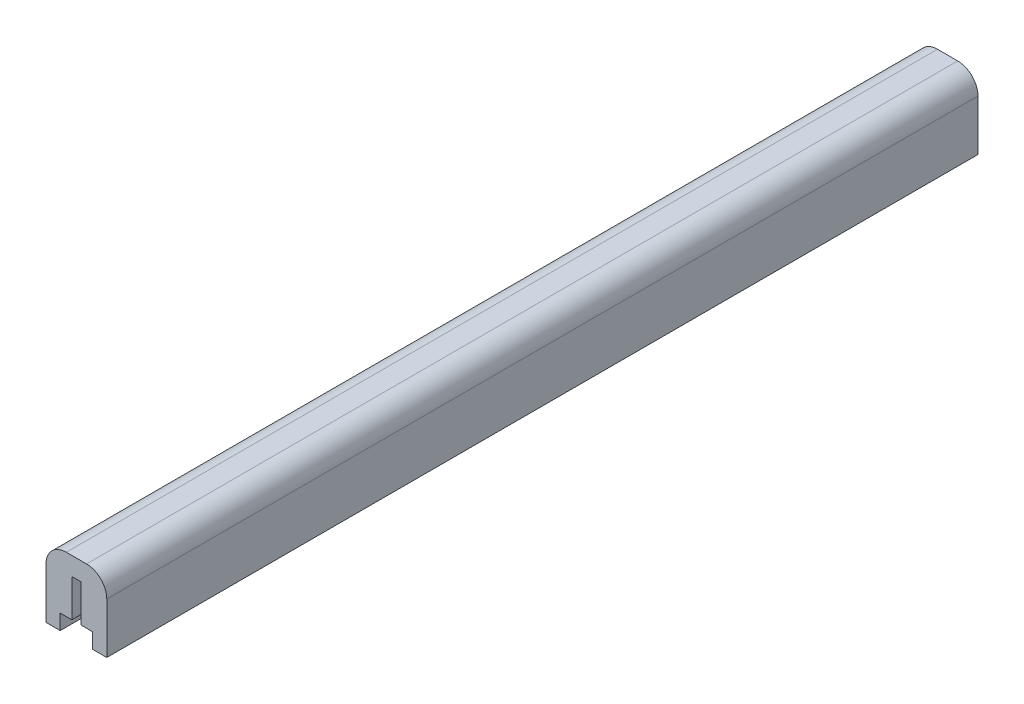
ISO-10303-21;
HEADER;
FILE_DESCRIPTION(('STEP AP214'),'2;1');
FILE_NAME('part.step','',(''),(''),'','','');
FILE_SCHEMA(('AUTOMOTIVE_DESIGN { 1 0 10303 214 1 1 1 1 }'));
ENDSEC;
DATA;
#1=APPLICATION_CONTEXT('core data for automotive mechanical design processes');
#2=APPLICATION_PROTOCOL_DEFINITION('international standard','automotive_design',2000,#1);
#3=PRODUCT_CONTEXT('',#1,'mechanical');
#4=PRODUCT('Part','Part','',(#3));
#5=PRODUCT_RELATED_PRODUCT_CATEGORY('part','',(#4));
#6=PRODUCT_DEFINITION_FORMATION('','',#4);
#7=PRODUCT_DEFINITION_CONTEXT('part definition',#1,'design');
#8=PRODUCT_DEFINITION('design','',#6,#7);
#9=PRODUCT_DEFINITION_SHAPE('','',#8);
#10=(LENGTH_UNIT() NAMED_UNIT(*) SI_UNIT(.MILLI.,.METRE.));
#11=(NAMED_UNIT(*) PLANE_ANGLE_UNIT() SI_UNIT($,.RADIAN.));
#12=(NAMED_UNIT(*) SI_UNIT($,.STERADIAN.) SOLID_ANGLE_UNIT());
#13=UNCERTAINTY_MEASURE_WITH_UNIT(LENGTH_MEASURE(1.E-05),#10,'distance_accuracy_value','');
#14=(GEOMETRIC_REPRESENTATION_CONTEXT(3) GLOBAL_UNCERTAINTY_ASSIGNED_CONTEXT((#13)) GLOBAL_UNIT_ASSIGNED_CONTEXT((#10,
#11,#12)) REPRESENTATION_CONTEXT('',''));
#15=CARTESIAN_POINT('',(0.,0.,0.));
#16=DIRECTION('',(0.,0.,1.));
#17=DIRECTION('',(1.,0.,0.));
#18=AXIS2_PLACEMENT_3D('',#15,#16,#17);
#19=CARTESIAN_POINT('',(8.,0.,430.));
#20=DIRECTION('',(0.,1.,0.));
#21=DIRECTION('',(-1.,0.,0.));
#22=AXIS2_PLACEMENT_3D('',#19,#20,#21);
#23=PLANE('',#22);
#24=DIRECTION('',(1.,0.,0.));
#25=VECTOR('',#24,1.);
#26=CARTESIAN_POINT('',(8.,0.,0.));
#27=LINE('',#26,#25);
#28=CARTESIAN_POINT('',(8.,0.,0.));
#29=VERTEX_POINT('',#28);
#30=CARTESIAN_POINT('',(15.,0.,0.));
#31=VERTEX_POINT('',#30);
#32=EDGE_CURVE('E169',#29,#31,#27,.T.);
#33=ORIENTED_EDGE('',*,*,#32,.T.);
#34=DIRECTION('',(0.,0.,-1.));
#35=VECTOR('',#34,1.);
#36=CARTESIAN_POINT('',(15.,0.,430.));
#37=LINE('',#36,#35);
#38=CARTESIAN_POINT('',(15.,0.,430.));
#39=VERTEX_POINT('',#38);
#40=EDGE_CURVE('E11',#39,#31,#37,.T.);
#41=ORIENTED_EDGE('',*,*,#40,.F.);
#42=DIRECTION('',(1.,0.,0.));
#43=VECTOR('',#42,1.);
#44=CARTESIAN_POINT('',(8.,0.,430.));
#45=LINE('',#44,#43);
#46=CARTESIAN_POINT('',(8.,0.,430.));
#47=VERTEX_POINT('',#46);
#48=EDGE_CURVE('E195',#47,#39,#45,.T.);
#49=ORIENTED_EDGE('',*,*,#48,.F.);
#50=DIRECTION('',(0.,0.,-1.));
#51=VECTOR('',#50,1.);
#52=CARTESIAN_POINT('',(8.,0.,430.));
#53=LINE('',#52,#51);
#54=EDGE_CURVE('E165',#47,#29,#53,.T.);
#55=ORIENTED_EDGE('',*,*,#54,.T.);
#56=EDGE_LOOP('',(#33,#41,#49,#55));
#57=FACE_BOUND('',#56,.T.);
#58=ADVANCED_FACE('F37',(#57),#23,.F.);
#59=CARTESIAN_POINT('',(15.,25.,430.));
#60=DIRECTION('',(-1.,0.,0.));
#61=DIRECTION('',(0.,-1.,0.));
#62=AXIS2_PLACEMENT_3D('',#59,#60,#61);
#63=PLANE('',#62);
#64=DIRECTION('',(0.,1.,0.));
#65=VECTOR('',#64,1.);
#66=CARTESIAN_POINT('',(15.,25.,0.));
#67=LINE('',#66,#65);
#68=CARTESIAN_POINT('',(15.,25.,0.));
#69=VERTEX_POINT('',#68);
#70=EDGE_CURVE('E172',#31,#69,#67,.T.);
#71=ORIENTED_EDGE('',*,*,#70,.T.);
#72=DIRECTION('',(0.,0.,-1.));
#73=VECTOR('',#72,1.);
#74=CARTESIAN_POINT('',(15.,25.,430.));
#75=LINE('',#74,#73);
#76=CARTESIAN_POINT('',(15.,25.,430.));
#77=VERTEX_POINT('',#76);
#78=EDGE_CURVE('E45',#77,#69,#75,.T.);
#79=ORIENTED_EDGE('',*,*,#78,.F.);
#80=DIRECTION('',(0.,1.,0.));
#81=VECTOR('',#80,1.);
#82=CARTESIAN_POINT('',(15.,25.,430.));
#83=LINE('',#82,#81);
#84=EDGE_CURVE('E114',#39,#77,#83,.T.);
#85=ORIENTED_EDGE('',*,*,#84,.F.);
#86=ORIENTED_EDGE('',*,*,#40,.T.);
#87=EDGE_LOOP('',(#71,#79,#85,#86));
#88=FACE_BOUND('',#87,.T.);
#89=ADVANCED_FACE('F283',(#88),#63,.F.);
#90=CARTESIAN_POINT('',(5.,25.,430.));
#91=DIRECTION('',(0.,0.,-1.));
#92=DIRECTION('',(-1.,0.,0.));
#93=AXIS2_PLACEMENT_3D('',#90,#91,#92);
#94=CYLINDRICAL_SURFACE('',#93,10.);
#95=CARTESIAN_POINT('',(5.,25.,0.));
#96=DIRECTION('',(0.,0.,1.));
#97=DIRECTION('',(-1.,0.,0.));
#98=AXIS2_PLACEMENT_3D('',#95,#96,#97);
#99=CIRCLE('',#98,10.);
#100=CARTESIAN_POINT('',(4.99999999999999,35.,0.));
#101=VERTEX_POINT('',#100);
#102=EDGE_CURVE('E174',#69,#101,#99,.T.);
#103=ORIENTED_EDGE('',*,*,#102,.T.);
#104=DIRECTION('',(0.,0.,-1.));
#105=VECTOR('',#104,1.);
#106=CARTESIAN_POINT('',(4.99999999999999,35.,430.));
#107=LINE('',#106,#105);
#108=CARTESIAN_POINT('',(4.99999999999999,35.,430.));
#109=VERTEX_POINT('',#108);
#110=EDGE_CURVE('E220',#109,#101,#107,.T.);
#111=ORIENTED_EDGE('',*,*,#110,.F.);
#112=CARTESIAN_POINT('',(5.,25.,430.));
#113=DIRECTION('',(0.,0.,1.));
#114=DIRECTION('',(-1.,0.,0.));
#115=AXIS2_PLACEMENT_3D('',#112,#113,#114);
#116=CIRCLE('',#115,10.);
#117=EDGE_CURVE('E228',#77,#109,#116,.T.);
#118=ORIENTED_EDGE('',*,*,#117,.F.);
#119=ORIENTED_EDGE('',*,*,#78,.T.);
#120=EDGE_LOOP('',(#103,#111,#118,#119));
#121=FACE_BOUND('',#120,.T.);
#122=ADVANCED_FACE('F226',(#121),#94,.T.);
#123=CARTESIAN_POINT('',(-5.,35.,430.));
#124=DIRECTION('',(0.,-1.,0.));
#125=DIRECTION('',(0.,0.,-1.));
#126=AXIS2_PLACEMENT_3D('',#123,#124,#125);
#127=PLANE('',#126);
#128=DIRECTION('',(-1.,0.,0.));
#129=VECTOR('',#128,1.);
#130=CARTESIAN_POINT('',(-5.,35.,0.));
#131=LINE('',#130,#129);
#132=CARTESIAN_POINT('',(-5.,35.,0.));
#133=VERTEX_POINT('',#132);
#134=EDGE_CURVE('E176',#101,#133,#131,.T.);
#135=ORIENTED_EDGE('',*,*,#134,.T.);
#136=DIRECTION('',(0.,0.,-1.));
#137=VECTOR('',#136,1.);
#138=CARTESIAN_POINT('',(-5.,35.,430.));
#139=LINE('',#138,#137);
#140=CARTESIAN_POINT('',(-5.,35.,430.));
#141=VERTEX_POINT('',#140);
#142=EDGE_CURVE('E217',#141,#133,#139,.T.);
#143=ORIENTED_EDGE('',*,*,#142,.F.);
#144=DIRECTION('',(-1.,0.,0.));
#145=VECTOR('',#144,1.);
#146=CARTESIAN_POINT('',(-5.,35.,430.));
#147=LINE('',#146,#145);
#148=EDGE_CURVE('E246',#109,#141,#147,.T.);
#149=ORIENTED_EDGE('',*,*,#148,.F.);
#150=ORIENTED_EDGE('',*,*,#110,.T.);
#151=EDGE_LOOP('',(#135,#143,#149,#150));
#152=FACE_BOUND('',#151,.T.);
#153=ADVANCED_FACE('F237',(#152),#127,.F.);
#154=CARTESIAN_POINT('',(-5.00000000000001,25.,430.));
#155=DIRECTION('',(0.,0.,-1.));
#156=DIRECTION('',(-1.,0.,0.));
#157=AXIS2_PLACEMENT_3D('',#154,#155,#156);
#158=CYLINDRICAL_SURFACE('',#157,10.);
#159=CARTESIAN_POINT('',(-5.00000000000001,25.,0.));
#160=DIRECTION('',(0.,0.,1.));
#161=DIRECTION('',(-1.,0.,0.));
#162=AXIS2_PLACEMENT_3D('',#159,#160,#161);
#163=CIRCLE('',#162,10.);
#164=CARTESIAN_POINT('',(-15.,25.,0.));
#165=VERTEX_POINT('',#164);
#166=EDGE_CURVE('E178',#133,#165,#163,.T.);
#167=ORIENTED_EDGE('',*,*,#166,.T.);
#168=DIRECTION('',(0.,0.,-1.));
#169=VECTOR('',#168,1.);
#170=CARTESIAN_POINT('',(-15.,25.,430.));
#171=LINE('',#170,#169);
#172=CARTESIAN_POINT('',(-15.,25.,430.));
#173=VERTEX_POINT('',#172);
#174=EDGE_CURVE('E214',#173,#165,#171,.T.);
#175=ORIENTED_EDGE('',*,*,#174,.F.);
#176=CARTESIAN_POINT('',(-5.00000000000001,25.,430.));
#177=DIRECTION('',(0.,0.,1.));
#178=DIRECTION('',(-1.,0.,0.));
#179=AXIS2_PLACEMENT_3D('',#176,#177,#178);
#180=CIRCLE('',#179,10.);
#181=EDGE_CURVE('E243',#141,#173,#180,.T.);
#182=ORIENTED_EDGE('',*,*,#181,.F.);
#183=ORIENTED_EDGE('',*,*,#142,.T.);
#184=EDGE_LOOP('',(#167,#175,#182,#183));
#185=FACE_BOUND('',#184,.T.);
#186=ADVANCED_FACE('F241',(#185),#158,.T.);
#187=CARTESIAN_POINT('',(-15.,0.,430.));
#188=DIRECTION('',(1.,0.,0.));
#189=DIRECTION('',(0.,1.,0.));
#190=AXIS2_PLACEMENT_3D('',#187,#188,#189);
#191=PLANE('',#190);
#192=DIRECTION('',(0.,-1.,0.));
#193=VECTOR('',#192,1.);
#194=CARTESIAN_POINT('',(-15.,0.,0.));
#195=LINE('',#194,#193);
#196=CARTESIAN_POINT('',(-15.,0.,0.));
#197=VERTEX_POINT('',#196);
#198=EDGE_CURVE('E180',#165,#197,#195,.T.);
#199=ORIENTED_EDGE('',*,*,#198,.T.);
#200=DIRECTION('',(0.,0.,-1.));
#201=VECTOR('',#200,1.);
#202=CARTESIAN_POINT('',(-15.,0.,430.));
#203=LINE('',#202,#201);
#204=CARTESIAN_POINT('',(-15.,0.,430.));
#205=VERTEX_POINT('',#204);
#206=EDGE_CURVE('E211',#205,#197,#203,.T.);
#207=ORIENTED_EDGE('',*,*,#206,.F.);
#208=DIRECTION('',(0.,-1.,0.));
#209=VECTOR('',#208,1.);
#210=CARTESIAN_POINT('',(-15.,0.,430.));
#211=LINE('',#210,#209);
#212=EDGE_CURVE('E245',#173,#205,#211,.T.);
#213=ORIENTED_EDGE('',*,*,#212,.F.);
#214=ORIENTED_EDGE('',*,*,#174,.T.);
#215=EDGE_LOOP('',(#199,#207,#213,#214));
#216=FACE_BOUND('',#215,.T.);
#217=ADVANCED_FACE('F296',(#216),#191,.F.);
#218=CARTESIAN_POINT('',(-15.,0.,430.));
#219=DIRECTION('',(0.,1.,0.));
#220=DIRECTION('',(0.,0.,1.));
#221=AXIS2_PLACEMENT_3D('',#218,#219,#220);
#222=PLANE('',#221);
#223=DIRECTION('',(1.,0.,0.));
#224=VECTOR('',#223,1.);
#225=CARTESIAN_POINT('',(-15.,0.,0.));
#226=LINE('',#225,#224);
#227=CARTESIAN_POINT('',(-8.,0.,0.));
#228=VERTEX_POINT('',#227);
#229=EDGE_CURVE('E182',#197,#228,#226,.T.);
#230=ORIENTED_EDGE('',*,*,#229,.T.);
#231=DIRECTION('',(0.,0.,-1.));
#232=VECTOR('',#231,1.);
#233=CARTESIAN_POINT('',(-8.,0.,430.));
#234=LINE('',#233,#232);
#235=CARTESIAN_POINT('',(-8.,0.,430.));
#236=VERTEX_POINT('',#235);
#237=EDGE_CURVE('E208',#236,#228,#234,.T.);
#238=ORIENTED_EDGE('',*,*,#237,.F.);
#239=DIRECTION('',(1.,0.,0.));
#240=VECTOR('',#239,1.);
#241=CARTESIAN_POINT('',(-15.,0.,430.));
#242=LINE('',#241,#240);
#243=EDGE_CURVE('E248',#205,#236,#242,.T.);
#244=ORIENTED_EDGE('',*,*,#243,.F.);
#245=ORIENTED_EDGE('',*,*,#206,.T.);
#246=EDGE_LOOP('',(#230,#238,#244,#245));
#247=FACE_BOUND('',#246,.T.);
#248=ADVANCED_FACE('F299',(#247),#222,.F.);
#249=CARTESIAN_POINT('',(-8.,0.,430.));
#250=DIRECTION('',(-1.,0.,0.));
#251=DIRECTION('',(0.,0.,1.));
#252=AXIS2_PLACEMENT_3D('',#249,#250,#251);
#253=PLANE('',#252);
#254=DIRECTION('',(0.,1.,0.));
#255=VECTOR('',#254,1.);
#256=CARTESIAN_POINT('',(-8.,0.,0.));
#257=LINE('',#256,#255);
#258=CARTESIAN_POINT('',(-8.,7.5,0.));
#259=VERTEX_POINT('',#258);
#260=EDGE_CURVE('E184',#228,#259,#257,.T.);
#261=ORIENTED_EDGE('',*,*,#260,.T.);
#262=DIRECTION('',(0.,0.,-1.));
#263=VECTOR('',#262,1.);
#264=CARTESIAN_POINT('',(-8.,7.5,430.));
#265=LINE('',#264,#263);
#266=CARTESIAN_POINT('',(-8.,7.5,430.));
#267=VERTEX_POINT('',#266);
#268=EDGE_CURVE('E205',#267,#259,#265,.T.);
#269=ORIENTED_EDGE('',*,*,#268,.F.);
#270=DIRECTION('',(0.,1.,0.));
#271=VECTOR('',#270,1.);
#272=CARTESIAN_POINT('',(-8.,0.,430.));
#273=LINE('',#272,#271);
#274=EDGE_CURVE('E254',#236,#267,#273,.T.);
#275=ORIENTED_EDGE('',*,*,#274,.F.);
#276=ORIENTED_EDGE('',*,*,#237,.T.);
#277=EDGE_LOOP('',(#261,#269,#275,#276));
#278=FACE_BOUND('',#277,.T.);
#279=ADVANCED_FACE('F303',(#278),#253,.F.);
#280=CARTESIAN_POINT('',(-8.,7.5,430.));
#281=DIRECTION('',(0.,1.,0.));
#282=DIRECTION('',(0.,0.,1.));
#283=AXIS2_PLACEMENT_3D('',#280,#281,#282);
#284=PLANE('',#283);
#285=DIRECTION('',(1.,0.,0.));
#286=VECTOR('',#285,1.);
#287=CARTESIAN_POINT('',(-8.,7.5,0.));
#288=LINE('',#287,#286);
#289=CARTESIAN_POINT('',(-2.25,7.5,0.));
#290=VERTEX_POINT('',#289);
#291=EDGE_CURVE('E186',#259,#290,#288,.T.);
#292=ORIENTED_EDGE('',*,*,#291,.T.);
#293=DIRECTION('',(0.,0.,-1.));
#294=VECTOR('',#293,1.);
#295=CARTESIAN_POINT('',(-2.25,7.5,430.));
#296=LINE('',#295,#294);
#297=CARTESIAN_POINT('',(-2.25,7.5,430.));
#298=VERTEX_POINT('',#297);
#299=EDGE_CURVE('E202',#298,#290,#296,.T.);
#300=ORIENTED_EDGE('',*,*,#299,.F.);
#301=DIRECTION('',(1.,0.,0.));
#302=VECTOR('',#301,1.);
#303=CARTESIAN_POINT('',(-8.,7.5,430.));
#304=LINE('',#303,#302);
#305=EDGE_CURVE('E256',#267,#298,#304,.T.);
#306=ORIENTED_EDGE('',*,*,#305,.F.);
#307=ORIENTED_EDGE('',*,*,#268,.T.);
#308=EDGE_LOOP('',(#292,#300,#306,#307));
#309=FACE_BOUND('',#308,.T.);
#310=ADVANCED_FACE('F307',(#309),#284,.F.);
#311=CARTESIAN_POINT('',(-2.25,7.5,430.));
#312=DIRECTION('',(-1.,0.,0.));
#313=DIRECTION('',(0.,0.,1.));
#314=AXIS2_PLACEMENT_3D('',#311,#312,#313);
#315=PLANE('',#314);
#316=DIRECTION('',(0.,1.,0.));
#317=VECTOR('',#316,1.);
#318=CARTESIAN_POINT('',(-2.25,7.5,0.));
#319=LINE('',#318,#317);
#320=CARTESIAN_POINT('',(-2.25,26.,0.));
#321=VERTEX_POINT('',#320);
#322=EDGE_CURVE('E188',#290,#321,#319,.T.);
#323=ORIENTED_EDGE('',*,*,#322,.T.);
#324=DIRECTION('',(0.,0.,-1.));
#325=VECTOR('',#324,1.);
#326=CARTESIAN_POINT('',(-2.25,26.,430.));
#327=LINE('',#326,#325);
#328=CARTESIAN_POINT('',(-2.25,26.,430.));
#329=VERTEX_POINT('',#328);
#330=EDGE_CURVE('E199',#329,#321,#327,.T.);
#331=ORIENTED_EDGE('',*,*,#330,.F.);
#332=DIRECTION('',(0.,1.,0.));
#333=VECTOR('',#332,1.);
#334=CARTESIAN_POINT('',(-2.25,7.5,430.));
#335=LINE('',#334,#333);
#336=EDGE_CURVE('E258',#298,#329,#335,.T.);
#337=ORIENTED_EDGE('',*,*,#336,.F.);
#338=ORIENTED_EDGE('',*,*,#299,.T.);
#339=EDGE_LOOP('',(#323,#331,#337,#338));
#340=FACE_BOUND('',#339,.T.);
#341=ADVANCED_FACE('F264',(#340),#315,.F.);
#342=CARTESIAN_POINT('',(-2.25,26.,430.));
#343=DIRECTION('',(0.,1.,0.));
#344=DIRECTION('',(0.,0.,1.));
#345=AXIS2_PLACEMENT_3D('',#342,#343,#344);
#346=PLANE('',#345);
#347=DIRECTION('',(1.,0.,0.));
#348=VECTOR('',#347,1.);
#349=CARTESIAN_POINT('',(-2.25,26.,0.));
#350=LINE('',#349,#348);
#351=CARTESIAN_POINT('',(2.25,26.,0.));
#352=VERTEX_POINT('',#351);
#353=EDGE_CURVE('E190',#321,#352,#350,.T.);
#354=ORIENTED_EDGE('',*,*,#353,.T.);
#355=DIRECTION('',(0.,0.,-1.));
#356=VECTOR('',#355,1.);
#357=CARTESIAN_POINT('',(2.25,26.,430.));
#358=LINE('',#357,#356);
#359=CARTESIAN_POINT('',(2.25,26.,430.));
#360=VERTEX_POINT('',#359);
#361=EDGE_CURVE('E160',#360,#352,#358,.T.);
#362=ORIENTED_EDGE('',*,*,#361,.F.);
#363=DIRECTION('',(1.,0.,0.));
#364=VECTOR('',#363,1.);
#365=CARTESIAN_POINT('',(-2.25,26.,430.));
#366=LINE('',#365,#364);
#367=EDGE_CURVE('E151',#329,#360,#366,.T.);
#368=ORIENTED_EDGE('',*,*,#367,.F.);
#369=ORIENTED_EDGE('',*,*,#330,.T.);
#370=EDGE_LOOP('',(#354,#362,#368,#369));
#371=FACE_BOUND('',#370,.T.);
#372=ADVANCED_FACE('F268',(#371),#346,.F.);
#373=CARTESIAN_POINT('',(2.25,26.,430.));
#374=DIRECTION('',(1.,0.,0.));
#375=DIRECTION('',(0.,0.,-1.));
#376=AXIS2_PLACEMENT_3D('',#373,#374,#375);
#377=PLANE('',#376);
#378=DIRECTION('',(0.,-1.,0.));
#379=VECTOR('',#378,1.);
#380=CARTESIAN_POINT('',(2.25,26.,0.));
#381=LINE('',#380,#379);
#382=CARTESIAN_POINT('',(2.25,7.5,0.));
#383=VERTEX_POINT('',#382);
#384=EDGE_CURVE('E159',#352,#383,#381,.T.);
#385=ORIENTED_EDGE('',*,*,#384,.T.);
#386=DIRECTION('',(0.,0.,-1.));
#387=VECTOR('',#386,1.);
#388=CARTESIAN_POINT('',(2.25,7.5,430.));
#389=LINE('',#388,#387);
#390=CARTESIAN_POINT('',(2.25,7.5,430.));
#391=VERTEX_POINT('',#390);
#392=EDGE_CURVE('E156',#391,#383,#389,.T.);
#393=ORIENTED_EDGE('',*,*,#392,.F.);
#394=DIRECTION('',(0.,-1.,0.));
#395=VECTOR('',#394,1.);
#396=CARTESIAN_POINT('',(2.25,26.,430.));
#397=LINE('',#396,#395);
#398=EDGE_CURVE('E145',#360,#391,#397,.T.);
#399=ORIENTED_EDGE('',*,*,#398,.F.);
#400=ORIENTED_EDGE('',*,*,#361,.T.);
#401=EDGE_LOOP('',(#385,#393,#399,#400));
#402=FACE_BOUND('',#401,.T.);
#403=ADVANCED_FACE('F157',(#402),#377,.F.);
#404=CARTESIAN_POINT('',(2.25,7.5,430.));
#405=DIRECTION('',(0.,1.,0.));
#406=DIRECTION('',(0.,0.,1.));
#407=AXIS2_PLACEMENT_3D('',#404,#405,#406);
#408=PLANE('',#407);
#409=DIRECTION('',(1.,0.,0.));
#410=VECTOR('',#409,1.);
#411=CARTESIAN_POINT('',(2.25,7.5,0.));
#412=LINE('',#411,#410);
#413=CARTESIAN_POINT('',(8.,7.5,0.));
#414=VERTEX_POINT('',#413);
#415=EDGE_CURVE('E100',#383,#414,#412,.T.);
#416=ORIENTED_EDGE('',*,*,#415,.T.);
#417=DIRECTION('',(0.,0.,-1.));
#418=VECTOR('',#417,1.);
#419=CARTESIAN_POINT('',(8.,7.5,430.));
#420=LINE('',#419,#418);
#421=CARTESIAN_POINT('',(8.,7.5,430.));
#422=VERTEX_POINT('',#421);
#423=EDGE_CURVE('E161',#422,#414,#420,.T.);
#424=ORIENTED_EDGE('',*,*,#423,.F.);
#425=DIRECTION('',(1.,0.,0.));
#426=VECTOR('',#425,1.);
#427=CARTESIAN_POINT('',(2.25,7.5,430.));
#428=LINE('',#427,#426);
#429=EDGE_CURVE('E149',#391,#422,#428,.T.);
#430=ORIENTED_EDGE('',*,*,#429,.F.);
#431=ORIENTED_EDGE('',*,*,#392,.T.);
#432=EDGE_LOOP('',(#416,#424,#430,#431));
#433=FACE_BOUND('',#432,.T.);
#434=ADVANCED_FACE('F163',(#433),#408,.F.);
#435=CARTESIAN_POINT('',(8.,7.5,430.));
#436=DIRECTION('',(1.,0.,0.));
#437=DIRECTION('',(0.,0.,-1.));
#438=AXIS2_PLACEMENT_3D('',#435,#436,#437);
#439=PLANE('',#438);
#440=DIRECTION('',(0.,-1.,0.));
#441=VECTOR('',#440,1.);
#442=CARTESIAN_POINT('',(8.,7.5,0.));
#443=LINE('',#442,#441);
#444=EDGE_CURVE('E106',#414,#29,#443,.T.);
#445=ORIENTED_EDGE('',*,*,#444,.T.);
#446=ORIENTED_EDGE('',*,*,#54,.F.);
#447=DIRECTION('',(0.,-1.,0.));
#448=VECTOR('',#447,1.);
#449=CARTESIAN_POINT('',(8.,7.5,430.));
#450=LINE('',#449,#448);
#451=EDGE_CURVE('E53',#422,#47,#450,.T.);
#452=ORIENTED_EDGE('',*,*,#451,.F.);
#453=ORIENTED_EDGE('',*,*,#423,.T.);
#454=EDGE_LOOP('',(#445,#446,#452,#453));
#455=FACE_BOUND('',#454,.T.);
#456=ADVANCED_FACE('F272',(#455),#439,.F.);
#457=CARTESIAN_POINT('',(5.,25.,430.));
#458=DIRECTION('',(0.,0.,-1.));
#459=DIRECTION('',(-1.,0.,0.));
#460=AXIS2_PLACEMENT_3D('',#457,#458,#459);
#461=PLANE('',#460);
#462=ORIENTED_EDGE('',*,*,#48,.T.);
#463=ORIENTED_EDGE('',*,*,#84,.T.);
#464=ORIENTED_EDGE('',*,*,#117,.T.);
#465=ORIENTED_EDGE('',*,*,#148,.T.);
#466=ORIENTED_EDGE('',*,*,#181,.T.);
#467=ORIENTED_EDGE('',*,*,#212,.T.);
#468=ORIENTED_EDGE('',*,*,#243,.T.);
#469=ORIENTED_EDGE('',*,*,#274,.T.);
#470=ORIENTED_EDGE('',*,*,#305,.T.);
#471=ORIENTED_EDGE('',*,*,#336,.T.);
#472=ORIENTED_EDGE('',*,*,#367,.T.);
#473=ORIENTED_EDGE('',*,*,#398,.T.);
#474=ORIENTED_EDGE('',*,*,#429,.T.);
#475=ORIENTED_EDGE('',*,*,#451,.T.);
#476=EDGE_LOOP('',(#462,#463,#464,#465,#466,#467,#468,#469,#470,#471,#472,#473,#474,#475));
#477=FACE_BOUND('',#476,.T.);
#478=ADVANCED_FACE('F147',(#477),#461,.F.);
#479=CARTESIAN_POINT('',(5.,25.,0.));
#480=DIRECTION('',(0.,0.,-1.));
#481=DIRECTION('',(-1.,0.,0.));
#482=AXIS2_PLACEMENT_3D('',#479,#480,#481);
#483=PLANE('',#482);
#484=ORIENTED_EDGE('',*,*,#32,.F.);
#485=ORIENTED_EDGE('',*,*,#444,.F.);
#486=ORIENTED_EDGE('',*,*,#415,.F.);
#487=ORIENTED_EDGE('',*,*,#384,.F.);
#488=ORIENTED_EDGE('',*,*,#353,.F.);
#489=ORIENTED_EDGE('',*,*,#322,.F.);
#490=ORIENTED_EDGE('',*,*,#291,.F.);
#491=ORIENTED_EDGE('',*,*,#260,.F.);
#492=ORIENTED_EDGE('',*,*,#229,.F.);
#493=ORIENTED_EDGE('',*,*,#198,.F.);
#494=ORIENTED_EDGE('',*,*,#166,.F.);
#495=ORIENTED_EDGE('',*,*,#134,.F.);
#496=ORIENTED_EDGE('',*,*,#102,.F.);
#497=ORIENTED_EDGE('',*,*,#70,.F.);
#498=EDGE_LOOP('',(#484,#485,#486,#487,#488,#489,#490,#491,#492,#493,#494,#495,#496,#497));
#499=FACE_BOUND('',#498,.T.);
#500=ADVANCED_FACE('F232',(#499),#483,.T.);
#501=CLOSED_SHELL('',(#58,#89,#122,#153,#186,#217,#248,#279,#310,#341,#372,#403,#434,#456,#478,#500));
#502=MANIFOLD_SOLID_BREP('B2',#501);
#503=ADVANCED_BREP_SHAPE_REPRESENTATION('',(#18,#502),#14);
#504=SHAPE_DEFINITION_REPRESENTATION(#9,#503);
ENDSEC;
END-ISO-10303-21;
